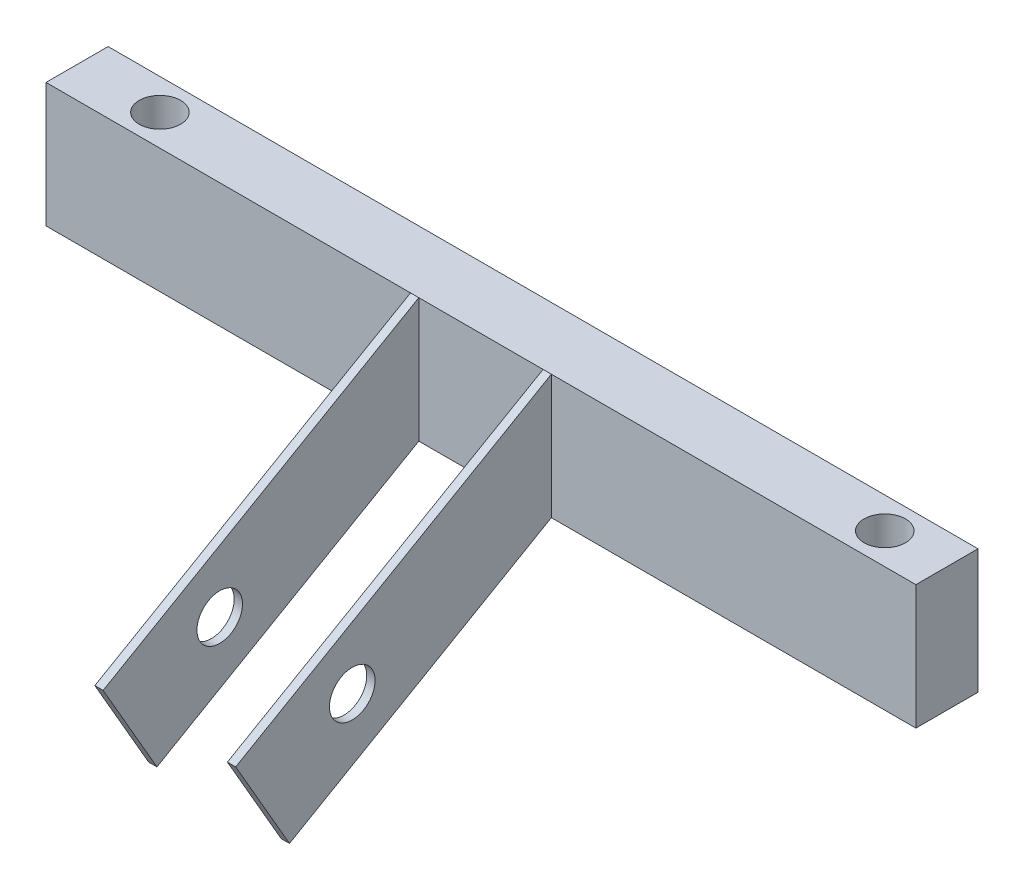
ISO-10303-21;
HEADER;
FILE_DESCRIPTION(('STEP AP214'),'2;1');
FILE_NAME('part.step','',(''),(''),'','','');
FILE_SCHEMA(('AUTOMOTIVE_DESIGN { 1 0 10303 214 1 1 1 1 }'));
ENDSEC;
DATA;
#1=APPLICATION_CONTEXT('core data for automotive mechanical design processes');
#2=APPLICATION_PROTOCOL_DEFINITION('international standard','automotive_design',2000,#1);
#3=PRODUCT_CONTEXT('',#1,'mechanical');
#4=PRODUCT('Part','Part','',(#3));
#5=PRODUCT_RELATED_PRODUCT_CATEGORY('part','',(#4));
#6=PRODUCT_DEFINITION_FORMATION('','',#4);
#7=PRODUCT_DEFINITION_CONTEXT('part definition',#1,'design');
#8=PRODUCT_DEFINITION('design','',#6,#7);
#9=PRODUCT_DEFINITION_SHAPE('','',#8);
#10=(LENGTH_UNIT() NAMED_UNIT(*) SI_UNIT(.MILLI.,.METRE.));
#11=(NAMED_UNIT(*) PLANE_ANGLE_UNIT() SI_UNIT($,.RADIAN.));
#12=(NAMED_UNIT(*) SI_UNIT($,.STERADIAN.) SOLID_ANGLE_UNIT());
#13=UNCERTAINTY_MEASURE_WITH_UNIT(LENGTH_MEASURE(1.E-05),#10,'distance_accuracy_value','');
#14=(GEOMETRIC_REPRESENTATION_CONTEXT(3) GLOBAL_UNCERTAINTY_ASSIGNED_CONTEXT((#13)) GLOBAL_UNIT_ASSIGNED_CONTEXT((#10,
#11,#12)) REPRESENTATION_CONTEXT('',''));
#15=CARTESIAN_POINT('',(0.,0.,0.));
#16=DIRECTION('',(0.,0.,1.));
#17=DIRECTION('',(1.,0.,0.));
#18=AXIS2_PLACEMENT_3D('',#15,#16,#17);
#19=CARTESIAN_POINT('',(-28.0007856919322,-42.9951905283831,74.4698544762641));
#20=DIRECTION('',(0.,-0.499999999999998,0.86602540378444));
#21=DIRECTION('',(0.,-0.86602540378444,-0.499999999999998));
#22=AXIS2_PLACEMENT_3D('',#19,#20,#21);
#23=PLANE('',#22);
#24=DIRECTION('',(-1.,0.,0.));
#25=VECTOR('',#24,1.);
#26=CARTESIAN_POINT('',(-28.0007856919322,-36.4999999999998,78.2198544762641));
#27=LINE('',#26,#25);
#28=CARTESIAN_POINT('',(-60.0007856919322,-36.4999999999998,78.2198544762641));
#29=VERTEX_POINT('',#28);
#30=CARTESIAN_POINT('',(-62.0007856919322,-36.4999999999998,78.2198544762641));
#31=VERTEX_POINT('',#30);
#32=EDGE_CURVE('E57',#29,#31,#27,.T.);
#33=ORIENTED_EDGE('',*,*,#32,.F.);
#34=DIRECTION('',(0.,0.86602540378444,0.499999999999998));
#35=VECTOR('',#34,1.);
#36=CARTESIAN_POINT('',(-60.0007856919322,-42.9951905283831,74.4698544762641));
#37=LINE('',#36,#35);
#38=CARTESIAN_POINT('',(-60.0007856919322,-13.9999999999998,91.2102355330307));
#39=VERTEX_POINT('',#38);
#40=EDGE_CURVE('E176',#29,#39,#37,.T.);
#41=ORIENTED_EDGE('',*,*,#40,.T.);
#42=DIRECTION('',(-1.,0.,0.));
#43=VECTOR('',#42,1.);
#44=CARTESIAN_POINT('',(-28.0007856919322,-13.9999999999998,91.2102355330307));
#45=LINE('',#44,#43);
#46=CARTESIAN_POINT('',(-62.0007856919322,-13.9999999999998,91.2102355330307));
#47=VERTEX_POINT('',#46);
#48=EDGE_CURVE('E163',#39,#47,#45,.T.);
#49=ORIENTED_EDGE('',*,*,#48,.T.);
#50=DIRECTION('',(0.,0.866025403784439,0.499999999999999));
#51=VECTOR('',#50,1.);
#52=CARTESIAN_POINT('',(-62.0007856919322,-13.9999999999998,91.2102355330307));
#53=LINE('',#52,#51);
#54=EDGE_CURVE('E186',#31,#47,#53,.T.);
#55=ORIENTED_EDGE('',*,*,#54,.F.);
#56=EDGE_LOOP('',(#33,#41,#49,#55));
#57=FACE_BOUND('',#56,.T.);
#58=ADVANCED_FACE('F40',(#57),#23,.T.);
#59=DIRECTION('',(0.,0.86602540378444,0.499999999999998));
#60=VECTOR('',#59,1.);
#61=CARTESIAN_POINT('',(-30.0007856919322,-42.9951905283831,74.4698544762641));
#62=LINE('',#61,#60);
#63=CARTESIAN_POINT('',(-30.0007856919322,-36.4999999999998,78.2198544762641));
#64=VERTEX_POINT('',#63);
#65=CARTESIAN_POINT('',(-30.0007856919322,-13.9999999999998,91.2102355330307));
#66=VERTEX_POINT('',#65);
#67=EDGE_CURVE('E178',#64,#66,#62,.T.);
#68=ORIENTED_EDGE('',*,*,#67,.F.);
#69=CARTESIAN_POINT('',(-28.0007856919322,-36.4999999999998,78.2198544762641));
#70=VERTEX_POINT('',#69);
#71=EDGE_CURVE('E205',#70,#64,#27,.T.);
#72=ORIENTED_EDGE('',*,*,#71,.F.);
#73=DIRECTION('',(0.,0.86602540378444,0.499999999999998));
#74=VECTOR('',#73,1.);
#75=CARTESIAN_POINT('',(-28.0007856919322,-42.9951905283831,74.4698544762641));
#76=LINE('',#75,#74);
#77=CARTESIAN_POINT('',(-28.0007856919322,-13.9999999999998,91.2102355330307));
#78=VERTEX_POINT('',#77);
#79=EDGE_CURVE('E196',#70,#78,#76,.T.);
#80=ORIENTED_EDGE('',*,*,#79,.T.);
#81=EDGE_CURVE('E201',#78,#66,#45,.T.);
#82=ORIENTED_EDGE('',*,*,#81,.T.);
#83=EDGE_LOOP('',(#68,#72,#80,#82));
#84=FACE_BOUND('',#83,.T.);
#85=ADVANCED_FACE('F289',(#84),#23,.T.);
#86=CARTESIAN_POINT('',(-28.0007856919322,6.49519052838327,3.74999999999997));
#87=DIRECTION('',(0.,-0.86602540378444,-0.499999999999998));
#88=DIRECTION('',(0.,0.499999999999998,-0.86602540378444));
#89=AXIS2_PLACEMENT_3D('',#86,#87,#88);
#90=PLANE('',#89);
#91=DIRECTION('',(1.,0.,0.));
#92=VECTOR('',#91,1.);
#93=CARTESIAN_POINT('',(-150.,0.,15.));
#94=LINE('',#93,#92);
#95=CARTESIAN_POINT('',(-62.0007856919322,0.,15.));
#96=VERTEX_POINT('',#95);
#97=CARTESIAN_POINT('',(-60.0007856919322,0.,15.));
#98=VERTEX_POINT('',#97);
#99=EDGE_CURVE('E211',#96,#98,#94,.T.);
#100=ORIENTED_EDGE('',*,*,#99,.T.);
#101=DIRECTION('',(0.,-0.499999999999998,0.86602540378444));
#102=VECTOR('',#101,1.);
#103=CARTESIAN_POINT('',(-60.0007856919322,6.49519052838327,3.74999999999997));
#104=LINE('',#103,#102);
#105=EDGE_CURVE('E139',#98,#29,#104,.T.);
#106=ORIENTED_EDGE('',*,*,#105,.T.);
#107=ORIENTED_EDGE('',*,*,#32,.T.);
#108=DIRECTION('',(0.,-0.499999999999998,0.86602540378444));
#109=VECTOR('',#108,1.);
#110=CARTESIAN_POINT('',(-62.0007856919322,-36.4999999999998,78.2198544762641));
#111=LINE('',#110,#109);
#112=EDGE_CURVE('E184',#96,#31,#111,.T.);
#113=ORIENTED_EDGE('',*,*,#112,.F.);
#114=EDGE_LOOP('',(#100,#106,#107,#113));
#115=FACE_BOUND('',#114,.T.);
#116=ADVANCED_FACE('F291',(#115),#90,.T.);
#117=ORIENTED_EDGE('',*,*,#71,.T.);
#118=DIRECTION('',(0.,0.499999999999998,-0.86602540378444));
#119=VECTOR('',#118,1.);
#120=CARTESIAN_POINT('',(-30.0007856919322,6.49519052838327,3.74999999999997));
#121=LINE('',#120,#119);
#122=CARTESIAN_POINT('',(-30.0007856919322,0.,15.));
#123=VERTEX_POINT('',#122);
#124=EDGE_CURVE('E169',#64,#123,#121,.T.);
#125=ORIENTED_EDGE('',*,*,#124,.T.);
#126=CARTESIAN_POINT('',(-28.0007856919322,0.,15.));
#127=VERTEX_POINT('',#126);
#128=EDGE_CURVE('E65',#123,#127,#94,.T.);
#129=ORIENTED_EDGE('',*,*,#128,.T.);
#130=DIRECTION('',(0.,-0.499999999999998,0.86602540378444));
#131=VECTOR('',#130,1.);
#132=CARTESIAN_POINT('',(-28.0007856919322,6.49519052838327,3.74999999999997));
#133=LINE('',#132,#131);
#134=EDGE_CURVE('E194',#127,#70,#133,.T.);
#135=ORIENTED_EDGE('',*,*,#134,.T.);
#136=EDGE_LOOP('',(#117,#125,#129,#135));
#137=FACE_BOUND('',#136,.T.);
#138=ADVANCED_FACE('F287',(#137),#90,.T.);
#139=CARTESIAN_POINT('',(-28.0007856919322,28.9951905283833,16.7403810567665));
#140=DIRECTION('',(0.,-0.86602540378444,-0.499999999999998));
#141=DIRECTION('',(0.,0.499999999999998,-0.86602540378444));
#142=AXIS2_PLACEMENT_3D('',#139,#140,#141);
#143=PLANE('',#142);
#144=DIRECTION('',(0.,-0.499999999999998,0.86602540378444));
#145=VECTOR('',#144,1.);
#146=CARTESIAN_POINT('',(-30.0007856919322,28.9951905283833,16.7403810567665));
#147=LINE('',#146,#145);
#148=CARTESIAN_POINT('',(-30.0007856919322,30.,15.));
#149=VERTEX_POINT('',#148);
#150=EDGE_CURVE('E164',#149,#66,#147,.T.);
#151=ORIENTED_EDGE('',*,*,#150,.T.);
#152=ORIENTED_EDGE('',*,*,#81,.F.);
#153=DIRECTION('',(0.,-0.499999999999998,0.86602540378444));
#154=VECTOR('',#153,1.);
#155=CARTESIAN_POINT('',(-28.0007856919322,28.9951905283833,16.7403810567665));
#156=LINE('',#155,#154);
#157=CARTESIAN_POINT('',(-28.0007856919322,30.,15.));
#158=VERTEX_POINT('',#157);
#159=EDGE_CURVE('E199',#158,#78,#156,.T.);
#160=ORIENTED_EDGE('',*,*,#159,.F.);
#161=DIRECTION('',(-1.,0.,0.));
#162=VECTOR('',#161,1.);
#163=CARTESIAN_POINT('',(60.,30.,15.));
#164=LINE('',#163,#162);
#165=EDGE_CURVE('E158',#158,#149,#164,.T.);
#166=ORIENTED_EDGE('',*,*,#165,.T.);
#167=EDGE_LOOP('',(#151,#152,#160,#166));
#168=FACE_BOUND('',#167,.T.);
#169=ADVANCED_FACE('F282',(#168),#143,.F.);
#170=CARTESIAN_POINT('',(0.,0.,15.));
#171=DIRECTION('',(0.,0.,1.));
#172=DIRECTION('',(1.,0.,0.));
#173=AXIS2_PLACEMENT_3D('',#170,#171,#172);
#174=PLANE('',#173);
#175=CARTESIAN_POINT('',(60.,30.,15.));
#176=VERTEX_POINT('',#175);
#177=EDGE_CURVE('E160',#176,#158,#164,.T.);
#178=ORIENTED_EDGE('',*,*,#177,.T.);
#179=DIRECTION('',(0.,-1.,0.));
#180=VECTOR('',#179,1.);
#181=CARTESIAN_POINT('',(-28.0007856919322,0.,15.));
#182=LINE('',#181,#180);
#183=EDGE_CURVE('E192',#158,#127,#182,.T.);
#184=ORIENTED_EDGE('',*,*,#183,.T.);
#185=CARTESIAN_POINT('',(60.,0.,15.));
#186=VERTEX_POINT('',#185);
#187=EDGE_CURVE('E212',#127,#186,#94,.T.);
#188=ORIENTED_EDGE('',*,*,#187,.T.);
#189=DIRECTION('',(0.,1.,0.));
#190=VECTOR('',#189,1.);
#191=CARTESIAN_POINT('',(60.,0.,15.));
#192=LINE('',#191,#190);
#193=EDGE_CURVE('E210',#186,#176,#192,.T.);
#194=ORIENTED_EDGE('',*,*,#193,.T.);
#195=EDGE_LOOP('',(#178,#184,#188,#194));
#196=FACE_BOUND('',#195,.T.);
#197=ADVANCED_FACE('F270',(#196),#174,.T.);
#198=CARTESIAN_POINT('',(-150.,0.,15.));
#199=VERTEX_POINT('',#198);
#200=EDGE_CURVE('E208',#199,#96,#94,.T.);
#201=ORIENTED_EDGE('',*,*,#200,.T.);
#202=DIRECTION('',(0.,-1.,0.));
#203=VECTOR('',#202,1.);
#204=CARTESIAN_POINT('',(-62.0007856919322,0.,15.));
#205=LINE('',#204,#203);
#206=CARTESIAN_POINT('',(-62.0007856919322,30.,15.));
#207=VERTEX_POINT('',#206);
#208=EDGE_CURVE('E181',#207,#96,#205,.T.);
#209=ORIENTED_EDGE('',*,*,#208,.F.);
#210=CARTESIAN_POINT('',(-150.,30.,15.));
#211=VERTEX_POINT('',#210);
#212=EDGE_CURVE('E154',#207,#211,#164,.T.);
#213=ORIENTED_EDGE('',*,*,#212,.T.);
#214=DIRECTION('',(0.,-1.,0.));
#215=VECTOR('',#214,1.);
#216=CARTESIAN_POINT('',(-150.,30.,15.));
#217=LINE('',#216,#215);
#218=EDGE_CURVE('E215',#211,#199,#217,.T.);
#219=ORIENTED_EDGE('',*,*,#218,.T.);
#220=EDGE_LOOP('',(#201,#209,#213,#219));
#221=FACE_BOUND('',#220,.T.);
#222=ADVANCED_FACE('F302',(#221),#174,.T.);
#223=CARTESIAN_POINT('',(0.,0.,15.));
#224=DIRECTION('',(0.,1.,0.));
#225=DIRECTION('',(0.,0.,1.));
#226=AXIS2_PLACEMENT_3D('',#223,#224,#225);
#227=PLANE('',#226);
#228=CARTESIAN_POINT('',(45.,0.,7.5));
#229=DIRECTION('',(0.,-1.,0.));
#230=DIRECTION('',(0.,0.,-1.));
#231=AXIS2_PLACEMENT_3D('',#228,#229,#230);
#232=CIRCLE('',#231,5.);
#233=CARTESIAN_POINT('',(45.,0.,2.5));
#234=VERTEX_POINT('',#233);
#235=EDGE_CURVE('E239',#234,#234,#232,.T.);
#236=ORIENTED_EDGE('',*,*,#235,.F.);
#237=EDGE_LOOP('',(#236));
#238=FACE_BOUND('',#237,.T.);
#239=CARTESIAN_POINT('',(-130.,0.,7.5));
#240=DIRECTION('',(0.,-1.,0.));
#241=DIRECTION('',(0.,0.,-1.));
#242=AXIS2_PLACEMENT_3D('',#239,#240,#241);
#243=CIRCLE('',#242,5.00000000000002);
#244=CARTESIAN_POINT('',(-130.,0.,2.49999999999998));
#245=VERTEX_POINT('',#244);
#246=EDGE_CURVE('E244',#245,#245,#243,.T.);
#247=ORIENTED_EDGE('',*,*,#246,.F.);
#248=EDGE_LOOP('',(#247));
#249=FACE_BOUND('',#248,.T.);
#250=DIRECTION('',(1.,0.,0.));
#251=VECTOR('',#250,1.);
#252=CARTESIAN_POINT('',(0.,0.,0.));
#253=LINE('',#252,#251);
#254=CARTESIAN_POINT('',(-150.,0.,0.));
#255=VERTEX_POINT('',#254);
#256=CARTESIAN_POINT('',(60.,0.,0.));
#257=VERTEX_POINT('',#256);
#258=EDGE_CURVE('E204',#255,#257,#253,.T.);
#259=ORIENTED_EDGE('',*,*,#258,.T.);
#260=DIRECTION('',(0.,0.,-1.));
#261=VECTOR('',#260,1.);
#262=CARTESIAN_POINT('',(60.,0.,15.));
#263=LINE('',#262,#261);
#264=EDGE_CURVE('E11',#186,#257,#263,.T.);
#265=ORIENTED_EDGE('',*,*,#264,.F.);
#266=ORIENTED_EDGE('',*,*,#187,.F.);
#267=ORIENTED_EDGE('',*,*,#128,.F.);
#268=DIRECTION('',(1.,0.,0.));
#269=VECTOR('',#268,1.);
#270=CARTESIAN_POINT('',(0.,0.,15.));
#271=LINE('',#270,#269);
#272=EDGE_CURVE('E171',#98,#123,#271,.T.);
#273=ORIENTED_EDGE('',*,*,#272,.F.);
#274=ORIENTED_EDGE('',*,*,#99,.F.);
#275=ORIENTED_EDGE('',*,*,#200,.F.);
#276=DIRECTION('',(0.,0.,-1.));
#277=VECTOR('',#276,1.);
#278=CARTESIAN_POINT('',(-150.,0.,15.));
#279=LINE('',#278,#277);
#280=EDGE_CURVE('E217',#199,#255,#279,.T.);
#281=ORIENTED_EDGE('',*,*,#280,.T.);
#282=EDGE_LOOP('',(#259,#265,#266,#267,#273,#274,#275,#281));
#283=FACE_BOUND('',#282,.T.);
#284=ADVANCED_FACE('F42',(#238,#249,#283),#227,.F.);
#285=CARTESIAN_POINT('',(60.,0.,15.));
#286=DIRECTION('',(-1.,0.,0.));
#287=DIRECTION('',(0.,0.,1.));
#288=AXIS2_PLACEMENT_3D('',#285,#286,#287);
#289=PLANE('',#288);
#290=DIRECTION('',(0.,1.,0.));
#291=VECTOR('',#290,1.);
#292=CARTESIAN_POINT('',(60.,0.,0.));
#293=LINE('',#292,#291);
#294=CARTESIAN_POINT('',(60.,30.,0.));
#295=VERTEX_POINT('',#294);
#296=EDGE_CURVE('E219',#257,#295,#293,.T.);
#297=ORIENTED_EDGE('',*,*,#296,.T.);
#298=DIRECTION('',(0.,0.,-1.));
#299=VECTOR('',#298,1.);
#300=CARTESIAN_POINT('',(60.,30.,15.));
#301=LINE('',#300,#299);
#302=EDGE_CURVE('E49',#176,#295,#301,.T.);
#303=ORIENTED_EDGE('',*,*,#302,.F.);
#304=ORIENTED_EDGE('',*,*,#193,.F.);
#305=ORIENTED_EDGE('',*,*,#264,.T.);
#306=EDGE_LOOP('',(#297,#303,#304,#305));
#307=FACE_BOUND('',#306,.T.);
#308=ADVANCED_FACE('F276',(#307),#289,.F.);
#309=CARTESIAN_POINT('',(60.,30.,15.));
#310=DIRECTION('',(0.,-1.,0.));
#311=DIRECTION('',(1.,0.,0.));
#312=AXIS2_PLACEMENT_3D('',#309,#310,#311);
#313=PLANE('',#312);
#314=CARTESIAN_POINT('',(45.,30.,7.5));
#315=DIRECTION('',(0.,-1.,0.));
#316=DIRECTION('',(1.,0.,0.));
#317=AXIS2_PLACEMENT_3D('',#314,#315,#316);
#318=CIRCLE('',#317,5.);
#319=CARTESIAN_POINT('',(50.,30.,7.5));
#320=VERTEX_POINT('',#319);
#321=EDGE_CURVE('E44',#320,#320,#318,.T.);
#322=ORIENTED_EDGE('',*,*,#321,.T.);
#323=EDGE_LOOP('',(#322));
#324=FACE_BOUND('',#323,.T.);
#325=CARTESIAN_POINT('',(-130.,30.,7.5));
#326=DIRECTION('',(0.,-1.,0.));
#327=DIRECTION('',(1.,0.,0.));
#328=AXIS2_PLACEMENT_3D('',#325,#326,#327);
#329=CIRCLE('',#328,5.00000000000002);
#330=CARTESIAN_POINT('',(-125.,30.,7.5));
#331=VERTEX_POINT('',#330);
#332=EDGE_CURVE('E237',#331,#331,#329,.T.);
#333=ORIENTED_EDGE('',*,*,#332,.T.);
#334=EDGE_LOOP('',(#333));
#335=FACE_BOUND('',#334,.T.);
#336=DIRECTION('',(-1.,0.,0.));
#337=VECTOR('',#336,1.);
#338=CARTESIAN_POINT('',(60.,30.,0.));
#339=LINE('',#338,#337);
#340=CARTESIAN_POINT('',(-150.,30.,0.));
#341=VERTEX_POINT('',#340);
#342=EDGE_CURVE('E221',#295,#341,#339,.T.);
#343=ORIENTED_EDGE('',*,*,#342,.T.);
#344=DIRECTION('',(0.,0.,-1.));
#345=VECTOR('',#344,1.);
#346=CARTESIAN_POINT('',(-150.,30.,15.));
#347=LINE('',#346,#345);
#348=EDGE_CURVE('E228',#211,#341,#347,.T.);
#349=ORIENTED_EDGE('',*,*,#348,.F.);
#350=ORIENTED_EDGE('',*,*,#212,.F.);
#351=CARTESIAN_POINT('',(-60.0007856919322,29.9999999999999,15.));
#352=VERTEX_POINT('',#351);
#353=EDGE_CURVE('E149',#352,#207,#164,.T.);
#354=ORIENTED_EDGE('',*,*,#353,.F.);
#355=DIRECTION('',(-1.,0.,0.));
#356=VECTOR('',#355,1.);
#357=CARTESIAN_POINT('',(0.,30.,15.));
#358=LINE('',#357,#356);
#359=EDGE_CURVE('E151',#149,#352,#358,.T.);
#360=ORIENTED_EDGE('',*,*,#359,.F.);
#361=ORIENTED_EDGE('',*,*,#165,.F.);
#362=ORIENTED_EDGE('',*,*,#177,.F.);
#363=ORIENTED_EDGE('',*,*,#302,.T.);
#364=EDGE_LOOP('',(#343,#349,#350,#354,#360,#361,#362,#363));
#365=FACE_BOUND('',#364,.T.);
#366=ADVANCED_FACE('F150',(#324,#335,#365),#313,.F.);
#367=CARTESIAN_POINT('',(-150.,30.,15.));
#368=DIRECTION('',(1.,0.,0.));
#369=DIRECTION('',(0.,1.,0.));
#370=AXIS2_PLACEMENT_3D('',#367,#368,#369);
#371=PLANE('',#370);
#372=DIRECTION('',(0.,-1.,0.));
#373=VECTOR('',#372,1.);
#374=CARTESIAN_POINT('',(-150.,30.,0.));
#375=LINE('',#374,#373);
#376=EDGE_CURVE('E223',#341,#255,#375,.T.);
#377=ORIENTED_EDGE('',*,*,#376,.T.);
#378=ORIENTED_EDGE('',*,*,#280,.F.);
#379=ORIENTED_EDGE('',*,*,#218,.F.);
#380=ORIENTED_EDGE('',*,*,#348,.T.);
#381=EDGE_LOOP('',(#377,#378,#379,#380));
#382=FACE_BOUND('',#381,.T.);
#383=ADVANCED_FACE('F309',(#382),#371,.F.);
#384=CARTESIAN_POINT('',(0.,0.,0.));
#385=DIRECTION('',(0.,0.,1.));
#386=DIRECTION('',(1.,0.,0.));
#387=AXIS2_PLACEMENT_3D('',#384,#385,#386);
#388=PLANE('',#387);
#389=ORIENTED_EDGE('',*,*,#258,.F.);
#390=ORIENTED_EDGE('',*,*,#376,.F.);
#391=ORIENTED_EDGE('',*,*,#342,.F.);
#392=ORIENTED_EDGE('',*,*,#296,.F.);
#393=EDGE_LOOP('',(#389,#390,#391,#392));
#394=FACE_BOUND('',#393,.T.);
#395=ADVANCED_FACE('F306',(#394),#388,.F.);
#396=ORIENTED_EDGE('',*,*,#48,.F.);
#397=DIRECTION('',(0.,-0.499999999999998,0.86602540378444));
#398=VECTOR('',#397,1.);
#399=CARTESIAN_POINT('',(-60.0007856919322,28.9951905283833,16.7403810567665));
#400=LINE('',#399,#398);
#401=EDGE_CURVE('E137',#352,#39,#400,.T.);
#402=ORIENTED_EDGE('',*,*,#401,.F.);
#403=ORIENTED_EDGE('',*,*,#353,.T.);
#404=DIRECTION('',(0.,0.499999999999998,-0.86602540378444));
#405=VECTOR('',#404,1.);
#406=CARTESIAN_POINT('',(-62.0007856919322,30.,15.));
#407=LINE('',#406,#405);
#408=EDGE_CURVE('E189',#47,#207,#407,.T.);
#409=ORIENTED_EDGE('',*,*,#408,.F.);
#410=EDGE_LOOP('',(#396,#402,#403,#409));
#411=FACE_BOUND('',#410,.T.);
#412=ADVANCED_FACE('F162',(#411),#143,.F.);
#413=CARTESIAN_POINT('',(-28.0007856919322,0.,0.));
#414=DIRECTION('',(-1.,0.,0.));
#415=DIRECTION('',(0.,0.,1.));
#416=AXIS2_PLACEMENT_3D('',#413,#414,#415);
#417=PLANE('',#416);
#418=CARTESIAN_POINT('',(-28.0007856919322,-12.7499999999998,63.0644099100364));
#419=DIRECTION('',(-1.,0.,0.));
#420=DIRECTION('',(0.,0.,1.));
#421=AXIS2_PLACEMENT_3D('',#418,#419,#420);
#422=CIRCLE('',#421,5.5);
#423=CARTESIAN_POINT('',(-28.0007856919322,-12.7499999999998,68.5644099100364));
#424=VERTEX_POINT('',#423);
#425=EDGE_CURVE('E255',#424,#424,#422,.T.);
#426=ORIENTED_EDGE('',*,*,#425,.T.);
#427=EDGE_LOOP('',(#426));
#428=FACE_BOUND('',#427,.T.);
#429=ORIENTED_EDGE('',*,*,#183,.F.);
#430=ORIENTED_EDGE('',*,*,#159,.T.);
#431=ORIENTED_EDGE('',*,*,#79,.F.);
#432=ORIENTED_EDGE('',*,*,#134,.F.);
#433=EDGE_LOOP('',(#429,#430,#431,#432));
#434=FACE_BOUND('',#433,.T.);
#435=ADVANCED_FACE('F285',(#428,#434),#417,.F.);
#436=CARTESIAN_POINT('',(-62.0007856919322,0.,0.));
#437=DIRECTION('',(1.,0.,0.));
#438=DIRECTION('',(0.,0.,-1.));
#439=AXIS2_PLACEMENT_3D('',#436,#437,#438);
#440=PLANE('',#439);
#441=CARTESIAN_POINT('',(-62.0007856919322,-12.7499999999998,63.0644099100364));
#442=DIRECTION('',(-1.,0.,0.));
#443=DIRECTION('',(0.,0.,1.));
#444=AXIS2_PLACEMENT_3D('',#441,#442,#443);
#445=CIRCLE('',#444,5.5);
#446=CARTESIAN_POINT('',(-62.0007856919322,-12.7499999999998,68.5644099100364));
#447=VERTEX_POINT('',#446);
#448=EDGE_CURVE('E236',#447,#447,#445,.T.);
#449=ORIENTED_EDGE('',*,*,#448,.F.);
#450=EDGE_LOOP('',(#449));
#451=FACE_BOUND('',#450,.T.);
#452=ORIENTED_EDGE('',*,*,#208,.T.);
#453=ORIENTED_EDGE('',*,*,#112,.T.);
#454=ORIENTED_EDGE('',*,*,#54,.T.);
#455=ORIENTED_EDGE('',*,*,#408,.T.);
#456=EDGE_LOOP('',(#452,#453,#454,#455));
#457=FACE_BOUND('',#456,.T.);
#458=ADVANCED_FACE('F347',(#451,#457),#440,.F.);
#459=CARTESIAN_POINT('',(-30.0007856919322,0.,0.));
#460=DIRECTION('',(-1.,0.,0.));
#461=DIRECTION('',(0.,0.,1.));
#462=AXIS2_PLACEMENT_3D('',#459,#460,#461);
#463=PLANE('',#462);
#464=ORIENTED_EDGE('',*,*,#150,.F.);
#465=DIRECTION('',(0.,1.,0.));
#466=VECTOR('',#465,1.);
#467=CARTESIAN_POINT('',(-30.0007856919322,-43.,15.));
#468=LINE('',#467,#466);
#469=EDGE_CURVE('E144',#123,#149,#468,.T.);
#470=ORIENTED_EDGE('',*,*,#469,.F.);
#471=ORIENTED_EDGE('',*,*,#124,.F.);
#472=ORIENTED_EDGE('',*,*,#67,.T.);
#473=EDGE_LOOP('',(#464,#470,#471,#472));
#474=FACE_BOUND('',#473,.T.);
#475=CARTESIAN_POINT('',(-30.0007856919322,-12.7499999999998,63.0644099100364));
#476=DIRECTION('',(-1.,0.,0.));
#477=DIRECTION('',(0.,0.,1.));
#478=AXIS2_PLACEMENT_3D('',#475,#476,#477);
#479=CIRCLE('',#478,5.5);
#480=CARTESIAN_POINT('',(-30.0007856919322,-12.7499999999998,68.5644099100364));
#481=VERTEX_POINT('',#480);
#482=EDGE_CURVE('E235',#481,#481,#479,.T.);
#483=ORIENTED_EDGE('',*,*,#482,.F.);
#484=EDGE_LOOP('',(#483));
#485=FACE_BOUND('',#484,.T.);
#486=ADVANCED_FACE('F264',(#474,#485),#463,.T.);
#487=CARTESIAN_POINT('',(-60.0007856919322,0.,0.));
#488=DIRECTION('',(1.,0.,0.));
#489=DIRECTION('',(0.,0.,-1.));
#490=AXIS2_PLACEMENT_3D('',#487,#488,#489);
#491=PLANE('',#490);
#492=DIRECTION('',(0.,1.,0.));
#493=VECTOR('',#492,1.);
#494=CARTESIAN_POINT('',(-60.0007856919322,-43.,15.));
#495=LINE('',#494,#493);
#496=EDGE_CURVE('E131',#98,#352,#495,.T.);
#497=ORIENTED_EDGE('',*,*,#496,.T.);
#498=ORIENTED_EDGE('',*,*,#401,.T.);
#499=ORIENTED_EDGE('',*,*,#40,.F.);
#500=ORIENTED_EDGE('',*,*,#105,.F.);
#501=EDGE_LOOP('',(#497,#498,#499,#500));
#502=FACE_BOUND('',#501,.T.);
#503=CARTESIAN_POINT('',(-60.0007856919322,-12.7499999999998,63.0644099100364));
#504=DIRECTION('',(1.,0.,0.));
#505=DIRECTION('',(0.,0.,-1.));
#506=AXIS2_PLACEMENT_3D('',#503,#504,#505);
#507=CIRCLE('',#506,5.5);
#508=CARTESIAN_POINT('',(-60.0007856919322,-12.7499999999998,57.5644099100364));
#509=VERTEX_POINT('',#508);
#510=EDGE_CURVE('E233',#509,#509,#507,.T.);
#511=ORIENTED_EDGE('',*,*,#510,.F.);
#512=EDGE_LOOP('',(#511));
#513=FACE_BOUND('',#512,.T.);
#514=ADVANCED_FACE('F133',(#502,#513),#491,.T.);
#515=CARTESIAN_POINT('',(-30.0007856919322,-43.,15.));
#516=DIRECTION('',(0.,0.,-1.));
#517=DIRECTION('',(-1.,0.,0.));
#518=AXIS2_PLACEMENT_3D('',#515,#516,#517);
#519=PLANE('',#518);
#520=ORIENTED_EDGE('',*,*,#469,.T.);
#521=ORIENTED_EDGE('',*,*,#359,.T.);
#522=ORIENTED_EDGE('',*,*,#496,.F.);
#523=ORIENTED_EDGE('',*,*,#272,.T.);
#524=EDGE_LOOP('',(#520,#521,#522,#523));
#525=FACE_BOUND('',#524,.T.);
#526=ADVANCED_FACE('F166',(#525),#519,.F.);
#527=CARTESIAN_POINT('',(10.9992143080678,-12.7499999999998,63.0644099100364));
#528=DIRECTION('',(-1.,0.,0.));
#529=DIRECTION('',(0.,0.,1.));
#530=AXIS2_PLACEMENT_3D('',#527,#528,#529);
#531=CYLINDRICAL_SURFACE('',#530,5.5);
#532=ORIENTED_EDGE('',*,*,#510,.T.);
#533=EDGE_LOOP('',(#532));
#534=FACE_BOUND('',#533,.T.);
#535=ORIENTED_EDGE('',*,*,#448,.T.);
#536=EDGE_LOOP('',(#535));
#537=FACE_BOUND('',#536,.T.);
#538=ADVANCED_FACE('F337',(#534,#537),#531,.F.);
#539=ORIENTED_EDGE('',*,*,#482,.T.);
#540=EDGE_LOOP('',(#539));
#541=FACE_BOUND('',#540,.T.);
#542=ORIENTED_EDGE('',*,*,#425,.F.);
#543=EDGE_LOOP('',(#542));
#544=FACE_BOUND('',#543,.T.);
#545=ADVANCED_FACE('F330',(#541,#544),#531,.F.);
#546=CARTESIAN_POINT('',(-130.,210.,7.5));
#547=DIRECTION('',(0.,-1.,0.));
#548=DIRECTION('',(0.,0.,-1.));
#549=AXIS2_PLACEMENT_3D('',#546,#547,#548);
#550=CYLINDRICAL_SURFACE('',#549,5.00000000000002);
#551=ORIENTED_EDGE('',*,*,#246,.T.);
#552=EDGE_LOOP('',(#551));
#553=FACE_BOUND('',#552,.T.);
#554=ORIENTED_EDGE('',*,*,#332,.F.);
#555=EDGE_LOOP('',(#554));
#556=FACE_BOUND('',#555,.T.);
#557=ADVANCED_FACE('F326',(#553,#556),#550,.F.);
#558=CARTESIAN_POINT('',(45.,210.,7.5));
#559=DIRECTION('',(0.,-1.,0.));
#560=DIRECTION('',(0.,0.,-1.));
#561=AXIS2_PLACEMENT_3D('',#558,#559,#560);
#562=CYLINDRICAL_SURFACE('',#561,5.);
#563=ORIENTED_EDGE('',*,*,#235,.T.);
#564=EDGE_LOOP('',(#563));
#565=FACE_BOUND('',#564,.T.);
#566=ORIENTED_EDGE('',*,*,#321,.F.);
#567=EDGE_LOOP('',(#566));
#568=FACE_BOUND('',#567,.T.);
#569=ADVANCED_FACE('F329',(#565,#568),#562,.F.);
#570=CLOSED_SHELL('',(#58,#85,#116,#138,#169,#197,#222,#284,#308,#366,#383,#395,#412,#435,#458,
#486,#514,#526,#538,#545,#557,#569));
#571=MANIFOLD_SOLID_BREP('B2',#570);
#572=ADVANCED_BREP_SHAPE_REPRESENTATION('',(#18,#571),#14);
#573=SHAPE_DEFINITION_REPRESENTATION(#9,#572);
ENDSEC;
END-ISO-10303-21;
